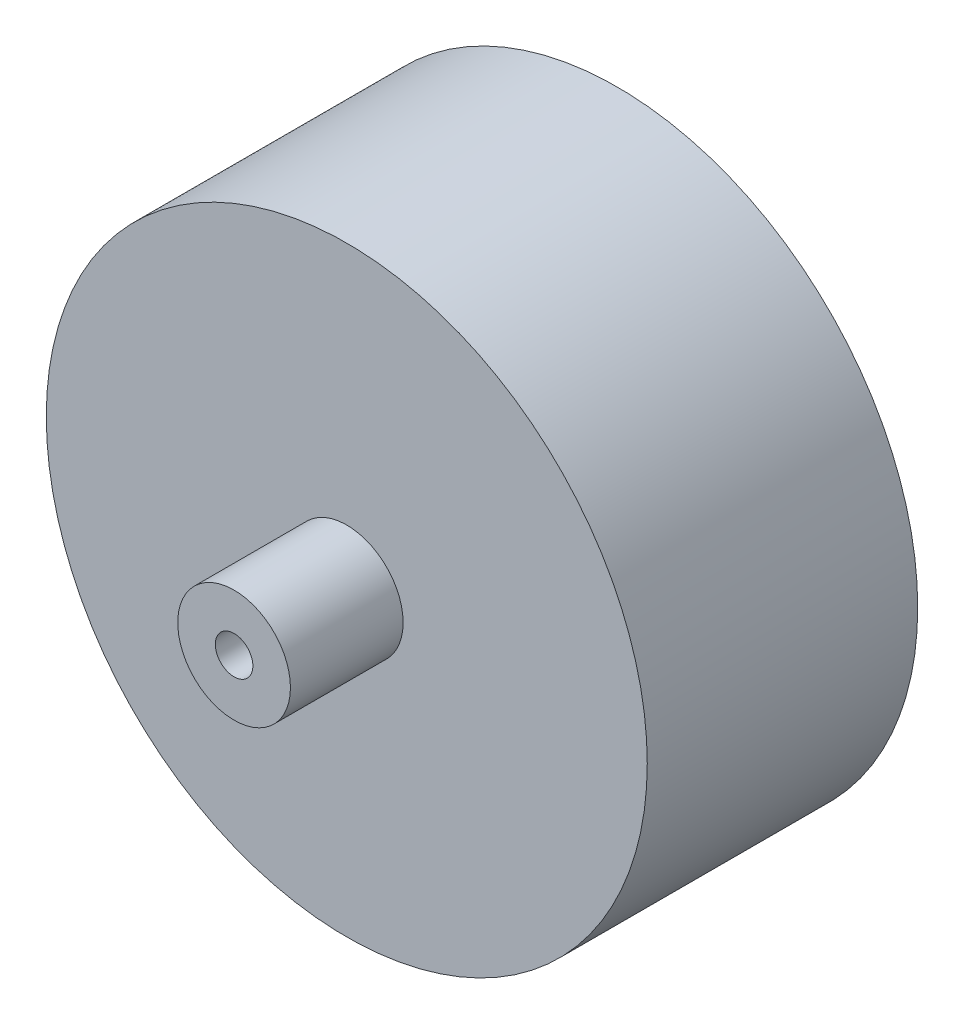
ISO-10303-21;
HEADER;
FILE_DESCRIPTION(('STEP AP214'),'2;1');
FILE_NAME('part.step','',(''),(''),'','','');
FILE_SCHEMA(('AUTOMOTIVE_DESIGN { 1 0 10303 214 1 1 1 1 }'));
ENDSEC;
DATA;
#1=APPLICATION_CONTEXT('core data for automotive mechanical design processes');
#2=APPLICATION_PROTOCOL_DEFINITION('international standard','automotive_design',2000,#1);
#3=PRODUCT_CONTEXT('',#1,'mechanical');
#4=PRODUCT('Part','Part','',(#3));
#5=PRODUCT_RELATED_PRODUCT_CATEGORY('part','',(#4));
#6=PRODUCT_DEFINITION_FORMATION('','',#4);
#7=PRODUCT_DEFINITION_CONTEXT('part definition',#1,'design');
#8=PRODUCT_DEFINITION('design','',#6,#7);
#9=PRODUCT_DEFINITION_SHAPE('','',#8);
#10=(LENGTH_UNIT() NAMED_UNIT(*) SI_UNIT(.MILLI.,.METRE.));
#11=(NAMED_UNIT(*) PLANE_ANGLE_UNIT() SI_UNIT($,.RADIAN.));
#12=(NAMED_UNIT(*) SI_UNIT($,.STERADIAN.) SOLID_ANGLE_UNIT());
#13=UNCERTAINTY_MEASURE_WITH_UNIT(LENGTH_MEASURE(1.E-05),#10,'distance_accuracy_value','');
#14=(GEOMETRIC_REPRESENTATION_CONTEXT(3) GLOBAL_UNCERTAINTY_ASSIGNED_CONTEXT((#13)) GLOBAL_UNIT_ASSIGNED_CONTEXT((#10,
#11,#12)) REPRESENTATION_CONTEXT('',''));
#15=CARTESIAN_POINT('',(0.,0.,0.));
#16=DIRECTION('',(0.,0.,1.));
#17=DIRECTION('',(1.,0.,0.));
#18=AXIS2_PLACEMENT_3D('',#15,#16,#17);
#19=CARTESIAN_POINT('',(0.,0.,36.));
#20=DIRECTION('',(0.,0.,-1.));
#21=DIRECTION('',(-1.,0.,0.));
#22=AXIS2_PLACEMENT_3D('',#19,#20,#21);
#23=CYLINDRICAL_SURFACE('',#22,40.);
#24=CARTESIAN_POINT('',(0.,0.,36.));
#25=DIRECTION('',(0.,0.,1.));
#26=DIRECTION('',(1.,0.,0.));
#27=AXIS2_PLACEMENT_3D('',#24,#25,#26);
#28=CIRCLE('',#27,40.);
#29=CARTESIAN_POINT('',(40.,0.,36.));
#30=VERTEX_POINT('',#29);
#31=EDGE_CURVE('E51',#30,#30,#28,.T.);
#32=ORIENTED_EDGE('',*,*,#31,.F.);
#33=EDGE_LOOP('',(#32));
#34=FACE_BOUND('',#33,.T.);
#35=CARTESIAN_POINT('',(0.,0.,0.));
#36=DIRECTION('',(0.,0.,1.));
#37=DIRECTION('',(1.,0.,0.));
#38=AXIS2_PLACEMENT_3D('',#35,#36,#37);
#39=CIRCLE('',#38,40.);
#40=CARTESIAN_POINT('',(40.,0.,0.));
#41=VERTEX_POINT('',#40);
#42=EDGE_CURVE('E46',#41,#41,#39,.T.);
#43=ORIENTED_EDGE('',*,*,#42,.T.);
#44=EDGE_LOOP('',(#43));
#45=FACE_BOUND('',#44,.T.);
#46=ADVANCED_FACE('F43',(#34,#45),#23,.T.);
#47=CARTESIAN_POINT('',(0.,0.,36.));
#48=DIRECTION('',(0.,0.,1.));
#49=DIRECTION('',(1.,0.,0.));
#50=AXIS2_PLACEMENT_3D('',#47,#48,#49);
#51=PLANE('',#50);
#52=CARTESIAN_POINT('',(0.,0.,36.));
#53=DIRECTION('',(0.,0.,1.));
#54=DIRECTION('',(1.,0.,0.));
#55=AXIS2_PLACEMENT_3D('',#52,#53,#54);
#56=CIRCLE('',#55,7.5);
#57=CARTESIAN_POINT('',(7.5,0.,36.));
#58=VERTEX_POINT('',#57);
#59=EDGE_CURVE('E10',#58,#58,#56,.T.);
#60=ORIENTED_EDGE('',*,*,#59,.F.);
#61=EDGE_LOOP('',(#60));
#62=FACE_BOUND('',#61,.T.);
#63=ORIENTED_EDGE('',*,*,#31,.T.);
#64=EDGE_LOOP('',(#63));
#65=FACE_BOUND('',#64,.T.);
#66=ADVANCED_FACE('F92',(#62,#65),#51,.T.);
#67=CARTESIAN_POINT('',(0.,0.,0.));
#68=DIRECTION('',(0.,0.,1.));
#69=DIRECTION('',(1.,0.,0.));
#70=AXIS2_PLACEMENT_3D('',#67,#68,#69);
#71=PLANE('',#70);
#72=ORIENTED_EDGE('',*,*,#42,.F.);
#73=EDGE_LOOP('',(#72));
#74=FACE_BOUND('',#73,.T.);
#75=ADVANCED_FACE('F87',(#74),#71,.F.);
#76=CARTESIAN_POINT('',(0.,0.,51.));
#77=DIRECTION('',(0.,0.,-1.));
#78=DIRECTION('',(-1.,0.,0.));
#79=AXIS2_PLACEMENT_3D('',#76,#77,#78);
#80=CYLINDRICAL_SURFACE('',#79,7.5);
#81=CARTESIAN_POINT('',(0.,0.,51.));
#82=DIRECTION('',(0.,0.,1.));
#83=DIRECTION('',(1.,0.,0.));
#84=AXIS2_PLACEMENT_3D('',#81,#82,#83);
#85=CIRCLE('',#84,7.5);
#86=CARTESIAN_POINT('',(7.5,0.,51.));
#87=VERTEX_POINT('',#86);
#88=EDGE_CURVE('E58',#87,#87,#85,.T.);
#89=ORIENTED_EDGE('',*,*,#88,.F.);
#90=EDGE_LOOP('',(#89));
#91=FACE_BOUND('',#90,.T.);
#92=ORIENTED_EDGE('',*,*,#59,.T.);
#93=EDGE_LOOP('',(#92));
#94=FACE_BOUND('',#93,.T.);
#95=ADVANCED_FACE('F82',(#91,#94),#80,.T.);
#96=CARTESIAN_POINT('',(0.,0.,51.));
#97=DIRECTION('',(0.,0.,1.));
#98=DIRECTION('',(1.,0.,0.));
#99=AXIS2_PLACEMENT_3D('',#96,#97,#98);
#100=PLANE('',#99);
#101=CARTESIAN_POINT('',(0.,0.,51.));
#102=DIRECTION('',(0.,0.,1.));
#103=DIRECTION('',(1.,0.,0.));
#104=AXIS2_PLACEMENT_3D('',#101,#102,#103);
#105=CIRCLE('',#104,2.5);
#106=CARTESIAN_POINT('',(2.5,0.,51.));
#107=VERTEX_POINT('',#106);
#108=EDGE_CURVE('E63',#107,#107,#105,.T.);
#109=ORIENTED_EDGE('',*,*,#108,.F.);
#110=EDGE_LOOP('',(#109));
#111=FACE_BOUND('',#110,.T.);
#112=ORIENTED_EDGE('',*,*,#88,.T.);
#113=EDGE_LOOP('',(#112));
#114=FACE_BOUND('',#113,.T.);
#115=ADVANCED_FACE('F76',(#111,#114),#100,.T.);
#116=CARTESIAN_POINT('',(0.,0.,36.));
#117=DIRECTION('',(0.,0.,1.));
#118=DIRECTION('',(1.,0.,0.));
#119=AXIS2_PLACEMENT_3D('',#116,#117,#118);
#120=CYLINDRICAL_SURFACE('',#119,2.5);
#121=CARTESIAN_POINT('',(0.,0.,36.));
#122=DIRECTION('',(0.,0.,1.));
#123=DIRECTION('',(1.,0.,0.));
#124=AXIS2_PLACEMENT_3D('',#121,#122,#123);
#125=CIRCLE('',#124,2.5);
#126=CARTESIAN_POINT('',(2.5,0.,36.));
#127=VERTEX_POINT('',#126);
#128=EDGE_CURVE('E62',#127,#127,#125,.T.);
#129=ORIENTED_EDGE('',*,*,#128,.F.);
#130=EDGE_LOOP('',(#129));
#131=FACE_BOUND('',#130,.T.);
#132=ORIENTED_EDGE('',*,*,#108,.T.);
#133=EDGE_LOOP('',(#132));
#134=FACE_BOUND('',#133,.T.);
#135=ADVANCED_FACE('F73',(#131,#134),#120,.F.);
#136=CARTESIAN_POINT('',(0.,0.,36.));
#137=DIRECTION('',(0.,0.,1.));
#138=DIRECTION('',(1.,0.,0.));
#139=AXIS2_PLACEMENT_3D('',#136,#137,#138);
#140=PLANE('',#139);
#141=ORIENTED_EDGE('',*,*,#128,.T.);
#142=EDGE_LOOP('',(#141));
#143=FACE_BOUND('',#142,.T.);
#144=ADVANCED_FACE('F71',(#143),#140,.T.);
#145=CLOSED_SHELL('',(#46,#66,#75,#95,#115,#135,#144));
#146=MANIFOLD_SOLID_BREP('B2',#145);
#147=ADVANCED_BREP_SHAPE_REPRESENTATION('',(#18,#146),#14);
#148=SHAPE_DEFINITION_REPRESENTATION(#9,#147);
ENDSEC;
END-ISO-10303-21;
